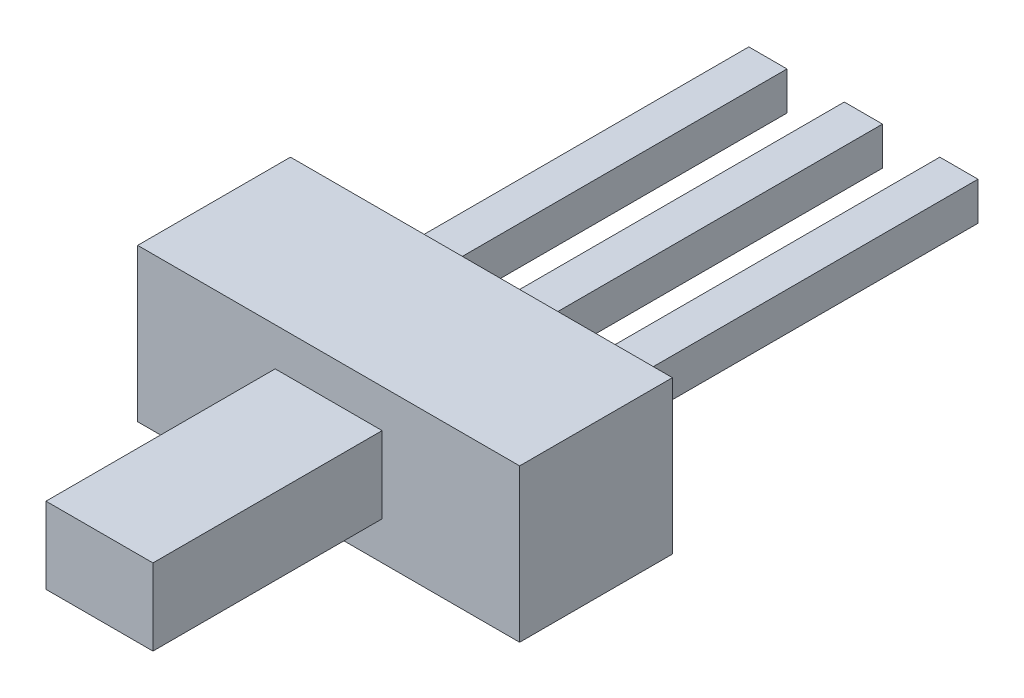
ISO-10303-21;
HEADER;
FILE_DESCRIPTION(('STEP AP214'),'2;1');
FILE_NAME('part.step','',(''),(''),'','','');
FILE_SCHEMA(('AUTOMOTIVE_DESIGN { 1 0 10303 214 1 1 1 1 }'));
ENDSEC;
DATA;
#1=APPLICATION_CONTEXT('core data for automotive mechanical design processes');
#2=APPLICATION_PROTOCOL_DEFINITION('international standard','automotive_design',2000,#1);
#3=PRODUCT_CONTEXT('',#1,'mechanical');
#4=PRODUCT('Part','Part','',(#3));
#5=PRODUCT_RELATED_PRODUCT_CATEGORY('part','',(#4));
#6=PRODUCT_DEFINITION_FORMATION('','',#4);
#7=PRODUCT_DEFINITION_CONTEXT('part definition',#1,'design');
#8=PRODUCT_DEFINITION('design','',#6,#7);
#9=PRODUCT_DEFINITION_SHAPE('','',#8);
#10=(LENGTH_UNIT() NAMED_UNIT(*) SI_UNIT(.MILLI.,.METRE.));
#11=(NAMED_UNIT(*) PLANE_ANGLE_UNIT() SI_UNIT($,.RADIAN.));
#12=(NAMED_UNIT(*) SI_UNIT($,.STERADIAN.) SOLID_ANGLE_UNIT());
#13=UNCERTAINTY_MEASURE_WITH_UNIT(LENGTH_MEASURE(1.E-05),#10,'distance_accuracy_value','');
#14=(GEOMETRIC_REPRESENTATION_CONTEXT(3) GLOBAL_UNCERTAINTY_ASSIGNED_CONTEXT((#13)) GLOBAL_UNIT_ASSIGNED_CONTEXT((#10,
#11,#12)) REPRESENTATION_CONTEXT('',''));
#15=CARTESIAN_POINT('',(0.,0.,0.));
#16=DIRECTION('',(0.,0.,1.));
#17=DIRECTION('',(1.,0.,0.));
#18=AXIS2_PLACEMENT_3D('',#15,#16,#17);
#19=CARTESIAN_POINT('',(0.,0.,0.));
#20=DIRECTION('',(0.,0.,1.));
#21=DIRECTION('',(1.,0.,0.));
#22=AXIS2_PLACEMENT_3D('',#19,#20,#21);
#23=PLANE('',#22);
#24=DIRECTION('',(0.,-1.,0.));
#25=VECTOR('',#24,1.);
#26=CARTESIAN_POINT('',(2.75,-1.25,0.));
#27=LINE('',#26,#25);
#28=CARTESIAN_POINT('',(2.75,-0.750000000000001,0.));
#29=VERTEX_POINT('',#28);
#30=CARTESIAN_POINT('',(2.75,-1.25,0.));
#31=VERTEX_POINT('',#30);
#32=EDGE_CURVE('E229',#29,#31,#27,.T.);
#33=ORIENTED_EDGE('',*,*,#32,.F.);
#34=DIRECTION('',(1.,0.,0.));
#35=VECTOR('',#34,1.);
#36=CARTESIAN_POINT('',(2.25,-0.750000000000001,0.));
#37=LINE('',#36,#35);
#38=CARTESIAN_POINT('',(2.25,-0.750000000000001,0.));
#39=VERTEX_POINT('',#38);
#40=EDGE_CURVE('E234',#39,#29,#37,.T.);
#41=ORIENTED_EDGE('',*,*,#40,.F.);
#42=DIRECTION('',(0.,1.,0.));
#43=VECTOR('',#42,1.);
#44=CARTESIAN_POINT('',(2.25,-1.25,0.));
#45=LINE('',#44,#43);
#46=CARTESIAN_POINT('',(2.25,-1.25,0.));
#47=VERTEX_POINT('',#46);
#48=EDGE_CURVE('E246',#47,#39,#45,.T.);
#49=ORIENTED_EDGE('',*,*,#48,.F.);
#50=DIRECTION('',(-1.,0.,0.));
#51=VECTOR('',#50,1.);
#52=CARTESIAN_POINT('',(2.25,-1.25,0.));
#53=LINE('',#52,#51);
#54=EDGE_CURVE('E243',#31,#47,#53,.T.);
#55=ORIENTED_EDGE('',*,*,#54,.F.);
#56=EDGE_LOOP('',(#33,#41,#49,#55));
#57=FACE_BOUND('',#56,.T.);
#58=DIRECTION('',(0.,-1.,0.));
#59=VECTOR('',#58,1.);
#60=CARTESIAN_POINT('',(0.,0.,0.));
#61=LINE('',#60,#59);
#62=CARTESIAN_POINT('',(0.,0.,0.));
#63=VERTEX_POINT('',#62);
#64=CARTESIAN_POINT('',(0.,-2.,0.));
#65=VERTEX_POINT('',#64);
#66=EDGE_CURVE('E295',#63,#65,#61,.T.);
#67=ORIENTED_EDGE('',*,*,#66,.F.);
#68=DIRECTION('',(-1.,0.,0.));
#69=VECTOR('',#68,1.);
#70=CARTESIAN_POINT('',(0.,0.,0.));
#71=LINE('',#70,#69);
#72=CARTESIAN_POINT('',(5.,0.,0.));
#73=VERTEX_POINT('',#72);
#74=EDGE_CURVE('E300',#73,#63,#71,.T.);
#75=ORIENTED_EDGE('',*,*,#74,.F.);
#76=DIRECTION('',(0.,1.,0.));
#77=VECTOR('',#76,1.);
#78=CARTESIAN_POINT('',(5.,0.,0.));
#79=LINE('',#78,#77);
#80=CARTESIAN_POINT('',(5.,-2.,0.));
#81=VERTEX_POINT('',#80);
#82=EDGE_CURVE('E311',#81,#73,#79,.T.);
#83=ORIENTED_EDGE('',*,*,#82,.F.);
#84=DIRECTION('',(1.,0.,0.));
#85=VECTOR('',#84,1.);
#86=CARTESIAN_POINT('',(0.,-2.,0.));
#87=LINE('',#86,#85);
#88=EDGE_CURVE('E309',#65,#81,#87,.T.);
#89=ORIENTED_EDGE('',*,*,#88,.F.);
#90=EDGE_LOOP('',(#67,#75,#83,#89));
#91=FACE_BOUND('',#90,.T.);
#92=DIRECTION('',(0.,-1.,0.));
#93=VECTOR('',#92,1.);
#94=CARTESIAN_POINT('',(1.5,-1.25,0.));
#95=LINE('',#94,#93);
#96=CARTESIAN_POINT('',(1.5,-0.750000000000001,0.));
#97=VERTEX_POINT('',#96);
#98=CARTESIAN_POINT('',(1.5,-1.25,0.));
#99=VERTEX_POINT('',#98);
#100=EDGE_CURVE('E262',#97,#99,#95,.T.);
#101=ORIENTED_EDGE('',*,*,#100,.F.);
#102=DIRECTION('',(1.,0.,0.));
#103=VECTOR('',#102,1.);
#104=CARTESIAN_POINT('',(1.,-0.750000000000001,0.));
#105=LINE('',#104,#103);
#106=CARTESIAN_POINT('',(1.,-0.750000000000001,0.));
#107=VERTEX_POINT('',#106);
#108=EDGE_CURVE('E267',#107,#97,#105,.T.);
#109=ORIENTED_EDGE('',*,*,#108,.F.);
#110=DIRECTION('',(0.,1.,0.));
#111=VECTOR('',#110,1.);
#112=CARTESIAN_POINT('',(1.,-1.25,0.));
#113=LINE('',#112,#111);
#114=CARTESIAN_POINT('',(1.,-1.25,0.));
#115=VERTEX_POINT('',#114);
#116=EDGE_CURVE('E279',#115,#107,#113,.T.);
#117=ORIENTED_EDGE('',*,*,#116,.F.);
#118=DIRECTION('',(-1.,0.,0.));
#119=VECTOR('',#118,1.);
#120=CARTESIAN_POINT('',(1.,-1.25,0.));
#121=LINE('',#120,#119);
#122=EDGE_CURVE('E276',#99,#115,#121,.T.);
#123=ORIENTED_EDGE('',*,*,#122,.F.);
#124=EDGE_LOOP('',(#101,#109,#117,#123));
#125=FACE_BOUND('',#124,.T.);
#126=DIRECTION('',(0.,-1.,0.));
#127=VECTOR('',#126,1.);
#128=CARTESIAN_POINT('',(4.00000000000001,-1.25,0.));
#129=LINE('',#128,#127);
#130=CARTESIAN_POINT('',(4.00000000000001,-0.750000000000001,0.));
#131=VERTEX_POINT('',#130);
#132=CARTESIAN_POINT('',(4.00000000000001,-1.25,0.));
#133=VERTEX_POINT('',#132);
#134=EDGE_CURVE('E191',#131,#133,#129,.T.);
#135=ORIENTED_EDGE('',*,*,#134,.F.);
#136=DIRECTION('',(1.,0.,0.));
#137=VECTOR('',#136,1.);
#138=CARTESIAN_POINT('',(3.5,-0.750000000000001,0.));
#139=LINE('',#138,#137);
#140=CARTESIAN_POINT('',(3.5,-0.750000000000001,0.));
#141=VERTEX_POINT('',#140);
#142=EDGE_CURVE('E204',#141,#131,#139,.T.);
#143=ORIENTED_EDGE('',*,*,#142,.F.);
#144=DIRECTION('',(0.,1.,0.));
#145=VECTOR('',#144,1.);
#146=CARTESIAN_POINT('',(3.5,-1.25,0.));
#147=LINE('',#146,#145);
#148=CARTESIAN_POINT('',(3.5,-1.25,0.));
#149=VERTEX_POINT('',#148);
#150=EDGE_CURVE('E213',#149,#141,#147,.T.);
#151=ORIENTED_EDGE('',*,*,#150,.F.);
#152=DIRECTION('',(-1.,0.,0.));
#153=VECTOR('',#152,1.);
#154=CARTESIAN_POINT('',(3.5,-1.25,0.));
#155=LINE('',#154,#153);
#156=EDGE_CURVE('E194',#133,#149,#155,.T.);
#157=ORIENTED_EDGE('',*,*,#156,.F.);
#158=EDGE_LOOP('',(#135,#143,#151,#157));
#159=FACE_BOUND('',#158,.T.);
#160=ADVANCED_FACE('F34',(#57,#91,#125,#159),#23,.F.);
#161=CARTESIAN_POINT('',(0.,0.,2.));
#162=DIRECTION('',(1.,0.,0.));
#163=DIRECTION('',(0.,1.,0.));
#164=AXIS2_PLACEMENT_3D('',#161,#162,#163);
#165=PLANE('',#164);
#166=ORIENTED_EDGE('',*,*,#66,.T.);
#167=DIRECTION('',(0.,0.,-1.));
#168=VECTOR('',#167,1.);
#169=CARTESIAN_POINT('',(0.,-2.,2.));
#170=LINE('',#169,#168);
#171=CARTESIAN_POINT('',(0.,-2.,2.));
#172=VERTEX_POINT('',#171);
#173=EDGE_CURVE('E11',#172,#65,#170,.T.);
#174=ORIENTED_EDGE('',*,*,#173,.F.);
#175=DIRECTION('',(0.,-1.,0.));
#176=VECTOR('',#175,1.);
#177=CARTESIAN_POINT('',(0.,0.,2.));
#178=LINE('',#177,#176);
#179=CARTESIAN_POINT('',(0.,0.,2.));
#180=VERTEX_POINT('',#179);
#181=EDGE_CURVE('E296',#180,#172,#178,.T.);
#182=ORIENTED_EDGE('',*,*,#181,.F.);
#183=DIRECTION('',(0.,0.,-1.));
#184=VECTOR('',#183,1.);
#185=CARTESIAN_POINT('',(0.,0.,2.));
#186=LINE('',#185,#184);
#187=EDGE_CURVE('E306',#180,#63,#186,.T.);
#188=ORIENTED_EDGE('',*,*,#187,.T.);
#189=EDGE_LOOP('',(#166,#174,#182,#188));
#190=FACE_BOUND('',#189,.T.);
#191=ADVANCED_FACE('F36',(#190),#165,.F.);
#192=CARTESIAN_POINT('',(0.,-2.,2.));
#193=DIRECTION('',(0.,1.,0.));
#194=DIRECTION('',(0.,0.,1.));
#195=AXIS2_PLACEMENT_3D('',#192,#193,#194);
#196=PLANE('',#195);
#197=ORIENTED_EDGE('',*,*,#88,.T.);
#198=DIRECTION('',(0.,0.,-1.));
#199=VECTOR('',#198,1.);
#200=CARTESIAN_POINT('',(5.,-2.,2.));
#201=LINE('',#200,#199);
#202=CARTESIAN_POINT('',(5.,-2.,2.));
#203=VERTEX_POINT('',#202);
#204=EDGE_CURVE('E42',#203,#81,#201,.T.);
#205=ORIENTED_EDGE('',*,*,#204,.F.);
#206=DIRECTION('',(1.,0.,0.));
#207=VECTOR('',#206,1.);
#208=CARTESIAN_POINT('',(0.,-2.,2.));
#209=LINE('',#208,#207);
#210=EDGE_CURVE('E299',#172,#203,#209,.T.);
#211=ORIENTED_EDGE('',*,*,#210,.F.);
#212=ORIENTED_EDGE('',*,*,#173,.T.);
#213=EDGE_LOOP('',(#197,#205,#211,#212));
#214=FACE_BOUND('',#213,.T.);
#215=ADVANCED_FACE('F339',(#214),#196,.F.);
#216=CARTESIAN_POINT('',(5.,0.,2.));
#217=DIRECTION('',(-1.,0.,0.));
#218=DIRECTION('',(0.,-1.,0.));
#219=AXIS2_PLACEMENT_3D('',#216,#217,#218);
#220=PLANE('',#219);
#221=ORIENTED_EDGE('',*,*,#82,.T.);
#222=DIRECTION('',(0.,0.,-1.));
#223=VECTOR('',#222,1.);
#224=CARTESIAN_POINT('',(5.,0.,2.));
#225=LINE('',#224,#223);
#226=CARTESIAN_POINT('',(5.,0.,2.));
#227=VERTEX_POINT('',#226);
#228=EDGE_CURVE('E316',#227,#73,#225,.T.);
#229=ORIENTED_EDGE('',*,*,#228,.F.);
#230=DIRECTION('',(0.,1.,0.));
#231=VECTOR('',#230,1.);
#232=CARTESIAN_POINT('',(5.,0.,2.));
#233=LINE('',#232,#231);
#234=EDGE_CURVE('E302',#203,#227,#233,.T.);
#235=ORIENTED_EDGE('',*,*,#234,.F.);
#236=ORIENTED_EDGE('',*,*,#204,.T.);
#237=EDGE_LOOP('',(#221,#229,#235,#236));
#238=FACE_BOUND('',#237,.T.);
#239=ADVANCED_FACE('F323',(#238),#220,.F.);
#240=CARTESIAN_POINT('',(0.,0.,2.));
#241=DIRECTION('',(0.,-1.,0.));
#242=DIRECTION('',(0.,0.,-1.));
#243=AXIS2_PLACEMENT_3D('',#240,#241,#242);
#244=PLANE('',#243);
#245=ORIENTED_EDGE('',*,*,#74,.T.);
#246=ORIENTED_EDGE('',*,*,#187,.F.);
#247=DIRECTION('',(-1.,0.,0.));
#248=VECTOR('',#247,1.);
#249=CARTESIAN_POINT('',(0.,0.,2.));
#250=LINE('',#249,#248);
#251=EDGE_CURVE('E304',#227,#180,#250,.T.);
#252=ORIENTED_EDGE('',*,*,#251,.F.);
#253=ORIENTED_EDGE('',*,*,#228,.T.);
#254=EDGE_LOOP('',(#245,#246,#252,#253));
#255=FACE_BOUND('',#254,.T.);
#256=ADVANCED_FACE('F332',(#255),#244,.F.);
#257=CARTESIAN_POINT('',(0.,0.,2.));
#258=DIRECTION('',(0.,0.,1.));
#259=DIRECTION('',(1.,0.,0.));
#260=AXIS2_PLACEMENT_3D('',#257,#258,#259);
#261=PLANE('',#260);
#262=DIRECTION('',(0.,1.,0.));
#263=VECTOR('',#262,1.);
#264=CARTESIAN_POINT('',(3.2,-0.500000000000001,2.));
#265=LINE('',#264,#263);
#266=CARTESIAN_POINT('',(3.2,-1.5,2.));
#267=VERTEX_POINT('',#266);
#268=CARTESIAN_POINT('',(3.2,-0.500000000000001,2.));
#269=VERTEX_POINT('',#268);
#270=EDGE_CURVE('E49',#267,#269,#265,.T.);
#271=ORIENTED_EDGE('',*,*,#270,.F.);
#272=DIRECTION('',(1.,0.,0.));
#273=VECTOR('',#272,1.);
#274=CARTESIAN_POINT('',(1.8,-1.5,2.));
#275=LINE('',#274,#273);
#276=CARTESIAN_POINT('',(1.8,-1.5,2.));
#277=VERTEX_POINT('',#276);
#278=EDGE_CURVE('E53',#277,#267,#275,.T.);
#279=ORIENTED_EDGE('',*,*,#278,.F.);
#280=DIRECTION('',(0.,-1.,0.));
#281=VECTOR('',#280,1.);
#282=CARTESIAN_POINT('',(1.8,-0.500000000000001,2.));
#283=LINE('',#282,#281);
#284=CARTESIAN_POINT('',(1.8,-0.500000000000001,2.));
#285=VERTEX_POINT('',#284);
#286=EDGE_CURVE('E584',#285,#277,#283,.T.);
#287=ORIENTED_EDGE('',*,*,#286,.F.);
#288=DIRECTION('',(-1.,0.,0.));
#289=VECTOR('',#288,1.);
#290=CARTESIAN_POINT('',(1.8,-0.500000000000001,2.));
#291=LINE('',#290,#289);
#292=EDGE_CURVE('E590',#269,#285,#291,.T.);
#293=ORIENTED_EDGE('',*,*,#292,.F.);
#294=EDGE_LOOP('',(#271,#279,#287,#293));
#295=FACE_BOUND('',#294,.T.);
#296=ORIENTED_EDGE('',*,*,#181,.T.);
#297=ORIENTED_EDGE('',*,*,#210,.T.);
#298=ORIENTED_EDGE('',*,*,#234,.T.);
#299=ORIENTED_EDGE('',*,*,#251,.T.);
#300=EDGE_LOOP('',(#296,#297,#298,#299));
#301=FACE_BOUND('',#300,.T.);
#302=ADVANCED_FACE('F338',(#295,#301),#261,.T.);
#303=CARTESIAN_POINT('',(1.5,-1.25,-5.));
#304=DIRECTION('',(-1.,0.,0.));
#305=DIRECTION('',(0.,-1.,0.));
#306=AXIS2_PLACEMENT_3D('',#303,#304,#305);
#307=PLANE('',#306);
#308=ORIENTED_EDGE('',*,*,#100,.T.);
#309=DIRECTION('',(0.,0.,1.));
#310=VECTOR('',#309,1.);
#311=CARTESIAN_POINT('',(1.5,-1.25,-5.));
#312=LINE('',#311,#310);
#313=CARTESIAN_POINT('',(1.5,-1.25,-5.));
#314=VERTEX_POINT('',#313);
#315=EDGE_CURVE('E292',#314,#99,#312,.T.);
#316=ORIENTED_EDGE('',*,*,#315,.F.);
#317=DIRECTION('',(0.,-1.,0.));
#318=VECTOR('',#317,1.);
#319=CARTESIAN_POINT('',(1.5,-1.25,-5.));
#320=LINE('',#319,#318);
#321=CARTESIAN_POINT('',(1.5,-0.750000000000001,-5.));
#322=VERTEX_POINT('',#321);
#323=EDGE_CURVE('E263',#322,#314,#320,.T.);
#324=ORIENTED_EDGE('',*,*,#323,.F.);
#325=DIRECTION('',(0.,0.,1.));
#326=VECTOR('',#325,1.);
#327=CARTESIAN_POINT('',(1.5,-0.750000000000001,-5.));
#328=LINE('',#327,#326);
#329=EDGE_CURVE('E273',#322,#97,#328,.T.);
#330=ORIENTED_EDGE('',*,*,#329,.T.);
#331=EDGE_LOOP('',(#308,#316,#324,#330));
#332=FACE_BOUND('',#331,.T.);
#333=ADVANCED_FACE('F358',(#332),#307,.F.);
#334=CARTESIAN_POINT('',(1.,-1.25,-5.));
#335=DIRECTION('',(0.,1.,0.));
#336=DIRECTION('',(0.,0.,1.));
#337=AXIS2_PLACEMENT_3D('',#334,#335,#336);
#338=PLANE('',#337);
#339=ORIENTED_EDGE('',*,*,#122,.T.);
#340=DIRECTION('',(0.,0.,1.));
#341=VECTOR('',#340,1.);
#342=CARTESIAN_POINT('',(1.,-1.25,-5.));
#343=LINE('',#342,#341);
#344=CARTESIAN_POINT('',(1.,-1.25,-5.));
#345=VERTEX_POINT('',#344);
#346=EDGE_CURVE('E289',#345,#115,#343,.T.);
#347=ORIENTED_EDGE('',*,*,#346,.F.);
#348=DIRECTION('',(-1.,0.,0.));
#349=VECTOR('',#348,1.);
#350=CARTESIAN_POINT('',(1.,-1.25,-5.));
#351=LINE('',#350,#349);
#352=EDGE_CURVE('E266',#314,#345,#351,.T.);
#353=ORIENTED_EDGE('',*,*,#352,.F.);
#354=ORIENTED_EDGE('',*,*,#315,.T.);
#355=EDGE_LOOP('',(#339,#347,#353,#354));
#356=FACE_BOUND('',#355,.T.);
#357=ADVANCED_FACE('F362',(#356),#338,.F.);
#358=CARTESIAN_POINT('',(1.,-1.25,-5.));
#359=DIRECTION('',(1.,0.,0.));
#360=DIRECTION('',(0.,0.,-1.));
#361=AXIS2_PLACEMENT_3D('',#358,#359,#360);
#362=PLANE('',#361);
#363=ORIENTED_EDGE('',*,*,#116,.T.);
#364=DIRECTION('',(0.,0.,1.));
#365=VECTOR('',#364,1.);
#366=CARTESIAN_POINT('',(1.,-0.750000000000001,-5.));
#367=LINE('',#366,#365);
#368=CARTESIAN_POINT('',(1.,-0.750000000000001,-5.));
#369=VERTEX_POINT('',#368);
#370=EDGE_CURVE('E286',#369,#107,#367,.T.);
#371=ORIENTED_EDGE('',*,*,#370,.F.);
#372=DIRECTION('',(0.,1.,0.));
#373=VECTOR('',#372,1.);
#374=CARTESIAN_POINT('',(1.,-1.25,-5.));
#375=LINE('',#374,#373);
#376=EDGE_CURVE('E269',#345,#369,#375,.T.);
#377=ORIENTED_EDGE('',*,*,#376,.F.);
#378=ORIENTED_EDGE('',*,*,#346,.T.);
#379=EDGE_LOOP('',(#363,#371,#377,#378));
#380=FACE_BOUND('',#379,.T.);
#381=ADVANCED_FACE('F367',(#380),#362,.F.);
#382=CARTESIAN_POINT('',(1.,-0.750000000000001,-5.));
#383=DIRECTION('',(0.,-1.,0.));
#384=DIRECTION('',(1.,0.,0.));
#385=AXIS2_PLACEMENT_3D('',#382,#383,#384);
#386=PLANE('',#385);
#387=ORIENTED_EDGE('',*,*,#108,.T.);
#388=ORIENTED_EDGE('',*,*,#329,.F.);
#389=DIRECTION('',(1.,0.,0.));
#390=VECTOR('',#389,1.);
#391=CARTESIAN_POINT('',(1.,-0.750000000000001,-5.));
#392=LINE('',#391,#390);
#393=EDGE_CURVE('E271',#369,#322,#392,.T.);
#394=ORIENTED_EDGE('',*,*,#393,.F.);
#395=ORIENTED_EDGE('',*,*,#370,.T.);
#396=EDGE_LOOP('',(#387,#388,#394,#395));
#397=FACE_BOUND('',#396,.T.);
#398=ADVANCED_FACE('F373',(#397),#386,.F.);
#399=CARTESIAN_POINT('',(0.,0.,-5.));
#400=DIRECTION('',(0.,0.,-1.));
#401=DIRECTION('',(-1.,0.,0.));
#402=AXIS2_PLACEMENT_3D('',#399,#400,#401);
#403=PLANE('',#402);
#404=ORIENTED_EDGE('',*,*,#323,.T.);
#405=ORIENTED_EDGE('',*,*,#352,.T.);
#406=ORIENTED_EDGE('',*,*,#376,.T.);
#407=ORIENTED_EDGE('',*,*,#393,.T.);
#408=EDGE_LOOP('',(#404,#405,#406,#407));
#409=FACE_BOUND('',#408,.T.);
#410=ADVANCED_FACE('F377',(#409),#403,.T.);
#411=CARTESIAN_POINT('',(2.75,-1.25,-5.));
#412=DIRECTION('',(-1.,0.,0.));
#413=DIRECTION('',(0.,0.,1.));
#414=AXIS2_PLACEMENT_3D('',#411,#412,#413);
#415=PLANE('',#414);
#416=ORIENTED_EDGE('',*,*,#32,.T.);
#417=DIRECTION('',(0.,0.,1.));
#418=VECTOR('',#417,1.);
#419=CARTESIAN_POINT('',(2.75,-1.25,-5.));
#420=LINE('',#419,#418);
#421=CARTESIAN_POINT('',(2.75,-1.25,-5.));
#422=VERTEX_POINT('',#421);
#423=EDGE_CURVE('E259',#422,#31,#420,.T.);
#424=ORIENTED_EDGE('',*,*,#423,.F.);
#425=DIRECTION('',(0.,-1.,0.));
#426=VECTOR('',#425,1.);
#427=CARTESIAN_POINT('',(2.75,-1.25,-5.));
#428=LINE('',#427,#426);
#429=CARTESIAN_POINT('',(2.75,-0.750000000000001,-5.));
#430=VERTEX_POINT('',#429);
#431=EDGE_CURVE('E230',#430,#422,#428,.T.);
#432=ORIENTED_EDGE('',*,*,#431,.F.);
#433=DIRECTION('',(0.,0.,1.));
#434=VECTOR('',#433,1.);
#435=CARTESIAN_POINT('',(2.75,-0.750000000000001,-5.));
#436=LINE('',#435,#434);
#437=EDGE_CURVE('E240',#430,#29,#436,.T.);
#438=ORIENTED_EDGE('',*,*,#437,.T.);
#439=EDGE_LOOP('',(#416,#424,#432,#438));
#440=FACE_BOUND('',#439,.T.);
#441=ADVANCED_FACE('F381',(#440),#415,.F.);
#442=CARTESIAN_POINT('',(2.25,-1.25,-5.));
#443=DIRECTION('',(0.,1.,0.));
#444=DIRECTION('',(-1.,0.,0.));
#445=AXIS2_PLACEMENT_3D('',#442,#443,#444);
#446=PLANE('',#445);
#447=ORIENTED_EDGE('',*,*,#54,.T.);
#448=DIRECTION('',(0.,0.,1.));
#449=VECTOR('',#448,1.);
#450=CARTESIAN_POINT('',(2.25,-1.25,-5.));
#451=LINE('',#450,#449);
#452=CARTESIAN_POINT('',(2.25,-1.25,-5.));
#453=VERTEX_POINT('',#452);
#454=EDGE_CURVE('E256',#453,#47,#451,.T.);
#455=ORIENTED_EDGE('',*,*,#454,.F.);
#456=DIRECTION('',(-1.,0.,0.));
#457=VECTOR('',#456,1.);
#458=CARTESIAN_POINT('',(2.25,-1.25,-5.));
#459=LINE('',#458,#457);
#460=EDGE_CURVE('E233',#422,#453,#459,.T.);
#461=ORIENTED_EDGE('',*,*,#460,.F.);
#462=ORIENTED_EDGE('',*,*,#423,.T.);
#463=EDGE_LOOP('',(#447,#455,#461,#462));
#464=FACE_BOUND('',#463,.T.);
#465=ADVANCED_FACE('F385',(#464),#446,.F.);
#466=CARTESIAN_POINT('',(2.25,-1.25,-5.));
#467=DIRECTION('',(1.,0.,0.));
#468=DIRECTION('',(0.,0.,-1.));
#469=AXIS2_PLACEMENT_3D('',#466,#467,#468);
#470=PLANE('',#469);
#471=ORIENTED_EDGE('',*,*,#48,.T.);
#472=DIRECTION('',(0.,0.,1.));
#473=VECTOR('',#472,1.);
#474=CARTESIAN_POINT('',(2.25,-0.750000000000001,-5.));
#475=LINE('',#474,#473);
#476=CARTESIAN_POINT('',(2.25,-0.750000000000001,-5.));
#477=VERTEX_POINT('',#476);
#478=EDGE_CURVE('E253',#477,#39,#475,.T.);
#479=ORIENTED_EDGE('',*,*,#478,.F.);
#480=DIRECTION('',(0.,1.,0.));
#481=VECTOR('',#480,1.);
#482=CARTESIAN_POINT('',(2.25,-1.25,-5.));
#483=LINE('',#482,#481);
#484=EDGE_CURVE('E236',#453,#477,#483,.T.);
#485=ORIENTED_EDGE('',*,*,#484,.F.);
#486=ORIENTED_EDGE('',*,*,#454,.T.);
#487=EDGE_LOOP('',(#471,#479,#485,#486));
#488=FACE_BOUND('',#487,.T.);
#489=ADVANCED_FACE('F389',(#488),#470,.F.);
#490=CARTESIAN_POINT('',(2.25,-0.750000000000001,-5.));
#491=DIRECTION('',(0.,-1.,0.));
#492=DIRECTION('',(0.,0.,-1.));
#493=AXIS2_PLACEMENT_3D('',#490,#491,#492);
#494=PLANE('',#493);
#495=ORIENTED_EDGE('',*,*,#40,.T.);
#496=ORIENTED_EDGE('',*,*,#437,.F.);
#497=DIRECTION('',(1.,0.,0.));
#498=VECTOR('',#497,1.);
#499=CARTESIAN_POINT('',(2.25,-0.750000000000001,-5.));
#500=LINE('',#499,#498);
#501=EDGE_CURVE('E238',#477,#430,#500,.T.);
#502=ORIENTED_EDGE('',*,*,#501,.F.);
#503=ORIENTED_EDGE('',*,*,#478,.T.);
#504=EDGE_LOOP('',(#495,#496,#502,#503));
#505=FACE_BOUND('',#504,.T.);
#506=ADVANCED_FACE('F393',(#505),#494,.F.);
#507=CARTESIAN_POINT('',(0.,0.,-5.));
#508=DIRECTION('',(0.,0.,-1.));
#509=DIRECTION('',(-1.,0.,0.));
#510=AXIS2_PLACEMENT_3D('',#507,#508,#509);
#511=PLANE('',#510);
#512=ORIENTED_EDGE('',*,*,#431,.T.);
#513=ORIENTED_EDGE('',*,*,#460,.T.);
#514=ORIENTED_EDGE('',*,*,#484,.T.);
#515=ORIENTED_EDGE('',*,*,#501,.T.);
#516=EDGE_LOOP('',(#512,#513,#514,#515));
#517=FACE_BOUND('',#516,.T.);
#518=ADVANCED_FACE('F397',(#517),#511,.T.);
#519=CARTESIAN_POINT('',(4.00000000000001,-1.25,-5.));
#520=DIRECTION('',(-1.,0.,0.));
#521=DIRECTION('',(0.,0.,1.));
#522=AXIS2_PLACEMENT_3D('',#519,#520,#521);
#523=PLANE('',#522);
#524=ORIENTED_EDGE('',*,*,#134,.T.);
#525=DIRECTION('',(0.,0.,1.));
#526=VECTOR('',#525,1.);
#527=CARTESIAN_POINT('',(4.00000000000001,-1.25,-5.));
#528=LINE('',#527,#526);
#529=CARTESIAN_POINT('',(4.00000000000001,-1.25,-5.));
#530=VERTEX_POINT('',#529);
#531=EDGE_CURVE('E226',#530,#133,#528,.T.);
#532=ORIENTED_EDGE('',*,*,#531,.F.);
#533=DIRECTION('',(0.,-1.,0.));
#534=VECTOR('',#533,1.);
#535=CARTESIAN_POINT('',(4.00000000000001,-1.25,-5.));
#536=LINE('',#535,#534);
#537=CARTESIAN_POINT('',(4.00000000000001,-0.750000000000001,-5.));
#538=VERTEX_POINT('',#537);
#539=EDGE_CURVE('E200',#538,#530,#536,.T.);
#540=ORIENTED_EDGE('',*,*,#539,.F.);
#541=DIRECTION('',(0.,0.,1.));
#542=VECTOR('',#541,1.);
#543=CARTESIAN_POINT('',(4.00000000000001,-0.750000000000001,-5.));
#544=LINE('',#543,#542);
#545=EDGE_CURVE('E209',#538,#131,#544,.T.);
#546=ORIENTED_EDGE('',*,*,#545,.T.);
#547=EDGE_LOOP('',(#524,#532,#540,#546));
#548=FACE_BOUND('',#547,.T.);
#549=ADVANCED_FACE('F401',(#548),#523,.F.);
#550=CARTESIAN_POINT('',(3.5,-1.25,-5.));
#551=DIRECTION('',(0.,1.,0.));
#552=DIRECTION('',(0.,0.,1.));
#553=AXIS2_PLACEMENT_3D('',#550,#551,#552);
#554=PLANE('',#553);
#555=ORIENTED_EDGE('',*,*,#156,.T.);
#556=DIRECTION('',(0.,0.,1.));
#557=VECTOR('',#556,1.);
#558=CARTESIAN_POINT('',(3.5,-1.25,-5.));
#559=LINE('',#558,#557);
#560=CARTESIAN_POINT('',(3.5,-1.25,-5.));
#561=VERTEX_POINT('',#560);
#562=EDGE_CURVE('E223',#561,#149,#559,.T.);
#563=ORIENTED_EDGE('',*,*,#562,.F.);
#564=DIRECTION('',(-1.,0.,0.));
#565=VECTOR('',#564,1.);
#566=CARTESIAN_POINT('',(3.5,-1.25,-5.));
#567=LINE('',#566,#565);
#568=EDGE_CURVE('E203',#530,#561,#567,.T.);
#569=ORIENTED_EDGE('',*,*,#568,.F.);
#570=ORIENTED_EDGE('',*,*,#531,.T.);
#571=EDGE_LOOP('',(#555,#563,#569,#570));
#572=FACE_BOUND('',#571,.T.);
#573=ADVANCED_FACE('F405',(#572),#554,.F.);
#574=CARTESIAN_POINT('',(3.5,-1.25,-5.));
#575=DIRECTION('',(1.,0.,0.));
#576=DIRECTION('',(0.,0.,-1.));
#577=AXIS2_PLACEMENT_3D('',#574,#575,#576);
#578=PLANE('',#577);
#579=ORIENTED_EDGE('',*,*,#150,.T.);
#580=DIRECTION('',(0.,0.,1.));
#581=VECTOR('',#580,1.);
#582=CARTESIAN_POINT('',(3.5,-0.750000000000001,-5.));
#583=LINE('',#582,#581);
#584=CARTESIAN_POINT('',(3.5,-0.750000000000001,-5.));
#585=VERTEX_POINT('',#584);
#586=EDGE_CURVE('E220',#585,#141,#583,.T.);
#587=ORIENTED_EDGE('',*,*,#586,.F.);
#588=DIRECTION('',(0.,1.,0.));
#589=VECTOR('',#588,1.);
#590=CARTESIAN_POINT('',(3.5,-1.25,-5.));
#591=LINE('',#590,#589);
#592=EDGE_CURVE('E206',#561,#585,#591,.T.);
#593=ORIENTED_EDGE('',*,*,#592,.F.);
#594=ORIENTED_EDGE('',*,*,#562,.T.);
#595=EDGE_LOOP('',(#579,#587,#593,#594));
#596=FACE_BOUND('',#595,.T.);
#597=ADVANCED_FACE('F409',(#596),#578,.F.);
#598=CARTESIAN_POINT('',(3.5,-0.750000000000001,-5.));
#599=DIRECTION('',(0.,-1.,0.));
#600=DIRECTION('',(1.,0.,0.));
#601=AXIS2_PLACEMENT_3D('',#598,#599,#600);
#602=PLANE('',#601);
#603=ORIENTED_EDGE('',*,*,#142,.T.);
#604=ORIENTED_EDGE('',*,*,#545,.F.);
#605=DIRECTION('',(1.,0.,0.));
#606=VECTOR('',#605,1.);
#607=CARTESIAN_POINT('',(3.5,-0.750000000000001,-5.));
#608=LINE('',#607,#606);
#609=EDGE_CURVE('E208',#585,#538,#608,.T.);
#610=ORIENTED_EDGE('',*,*,#609,.F.);
#611=ORIENTED_EDGE('',*,*,#586,.T.);
#612=EDGE_LOOP('',(#603,#604,#610,#611));
#613=FACE_BOUND('',#612,.T.);
#614=ADVANCED_FACE('F413',(#613),#602,.F.);
#615=CARTESIAN_POINT('',(0.,0.,-5.));
#616=DIRECTION('',(0.,0.,-1.));
#617=DIRECTION('',(-1.,0.,0.));
#618=AXIS2_PLACEMENT_3D('',#615,#616,#617);
#619=PLANE('',#618);
#620=ORIENTED_EDGE('',*,*,#539,.T.);
#621=ORIENTED_EDGE('',*,*,#568,.T.);
#622=ORIENTED_EDGE('',*,*,#592,.T.);
#623=ORIENTED_EDGE('',*,*,#609,.T.);
#624=EDGE_LOOP('',(#620,#621,#622,#623));
#625=FACE_BOUND('',#624,.T.);
#626=ADVANCED_FACE('F417',(#625),#619,.T.);
#627=CARTESIAN_POINT('',(3.2,-0.500000000000001,5.));
#628=DIRECTION('',(-1.,0.,0.));
#629=DIRECTION('',(0.,0.,1.));
#630=AXIS2_PLACEMENT_3D('',#627,#628,#629);
#631=PLANE('',#630);
#632=ORIENTED_EDGE('',*,*,#270,.T.);
#633=DIRECTION('',(0.,0.,-1.));
#634=VECTOR('',#633,1.);
#635=CARTESIAN_POINT('',(3.2,-0.500000000000001,5.));
#636=LINE('',#635,#634);
#637=CARTESIAN_POINT('',(3.2,-0.500000000000001,5.));
#638=VERTEX_POINT('',#637);
#639=EDGE_CURVE('E174',#638,#269,#636,.T.);
#640=ORIENTED_EDGE('',*,*,#639,.F.);
#641=DIRECTION('',(0.,1.,0.));
#642=VECTOR('',#641,1.);
#643=CARTESIAN_POINT('',(3.2,-0.500000000000001,5.));
#644=LINE('',#643,#642);
#645=CARTESIAN_POINT('',(3.2,-1.5,5.));
#646=VERTEX_POINT('',#645);
#647=EDGE_CURVE('E180',#646,#638,#644,.T.);
#648=ORIENTED_EDGE('',*,*,#647,.F.);
#649=DIRECTION('',(0.,0.,-1.));
#650=VECTOR('',#649,1.);
#651=CARTESIAN_POINT('',(3.2,-1.5,5.));
#652=LINE('',#651,#650);
#653=EDGE_CURVE('E582',#646,#267,#652,.T.);
#654=ORIENTED_EDGE('',*,*,#653,.T.);
#655=EDGE_LOOP('',(#632,#640,#648,#654));
#656=FACE_BOUND('',#655,.T.);
#657=ADVANCED_FACE('F190',(#656),#631,.F.);
#658=CARTESIAN_POINT('',(1.8,-0.500000000000001,5.));
#659=DIRECTION('',(0.,-1.,0.));
#660=DIRECTION('',(0.,0.,-1.));
#661=AXIS2_PLACEMENT_3D('',#658,#659,#660);
#662=PLANE('',#661);
#663=ORIENTED_EDGE('',*,*,#292,.T.);
#664=DIRECTION('',(0.,0.,-1.));
#665=VECTOR('',#664,1.);
#666=CARTESIAN_POINT('',(1.8,-0.500000000000001,5.));
#667=LINE('',#666,#665);
#668=CARTESIAN_POINT('',(1.8,-0.500000000000001,5.));
#669=VERTEX_POINT('',#668);
#670=EDGE_CURVE('E176',#669,#285,#667,.T.);
#671=ORIENTED_EDGE('',*,*,#670,.F.);
#672=DIRECTION('',(-1.,0.,0.));
#673=VECTOR('',#672,1.);
#674=CARTESIAN_POINT('',(1.8,-0.500000000000001,5.));
#675=LINE('',#674,#673);
#676=EDGE_CURVE('E169',#638,#669,#675,.T.);
#677=ORIENTED_EDGE('',*,*,#676,.F.);
#678=ORIENTED_EDGE('',*,*,#639,.T.);
#679=EDGE_LOOP('',(#663,#671,#677,#678));
#680=FACE_BOUND('',#679,.T.);
#681=ADVANCED_FACE('F172',(#680),#662,.F.);
#682=CARTESIAN_POINT('',(1.8,-0.500000000000001,5.));
#683=DIRECTION('',(1.,0.,0.));
#684=DIRECTION('',(0.,1.,0.));
#685=AXIS2_PLACEMENT_3D('',#682,#683,#684);
#686=PLANE('',#685);
#687=ORIENTED_EDGE('',*,*,#286,.T.);
#688=DIRECTION('',(0.,0.,-1.));
#689=VECTOR('',#688,1.);
#690=CARTESIAN_POINT('',(1.8,-1.5,5.));
#691=LINE('',#690,#689);
#692=CARTESIAN_POINT('',(1.8,-1.5,5.));
#693=VERTEX_POINT('',#692);
#694=EDGE_CURVE('E196',#693,#277,#691,.T.);
#695=ORIENTED_EDGE('',*,*,#694,.F.);
#696=DIRECTION('',(0.,-1.,0.));
#697=VECTOR('',#696,1.);
#698=CARTESIAN_POINT('',(1.8,-0.500000000000001,5.));
#699=LINE('',#698,#697);
#700=EDGE_CURVE('E179',#669,#693,#699,.T.);
#701=ORIENTED_EDGE('',*,*,#700,.F.);
#702=ORIENTED_EDGE('',*,*,#670,.T.);
#703=EDGE_LOOP('',(#687,#695,#701,#702));
#704=FACE_BOUND('',#703,.T.);
#705=ADVANCED_FACE('F426',(#704),#686,.F.);
#706=CARTESIAN_POINT('',(1.8,-1.5,5.));
#707=DIRECTION('',(0.,1.,0.));
#708=DIRECTION('',(0.,0.,1.));
#709=AXIS2_PLACEMENT_3D('',#706,#707,#708);
#710=PLANE('',#709);
#711=ORIENTED_EDGE('',*,*,#278,.T.);
#712=ORIENTED_EDGE('',*,*,#653,.F.);
#713=DIRECTION('',(1.,0.,0.));
#714=VECTOR('',#713,1.);
#715=CARTESIAN_POINT('',(1.8,-1.5,5.));
#716=LINE('',#715,#714);
#717=EDGE_CURVE('E185',#693,#646,#716,.T.);
#718=ORIENTED_EDGE('',*,*,#717,.F.);
#719=ORIENTED_EDGE('',*,*,#694,.T.);
#720=EDGE_LOOP('',(#711,#712,#718,#719));
#721=FACE_BOUND('',#720,.T.);
#722=ADVANCED_FACE('F429',(#721),#710,.F.);
#723=CARTESIAN_POINT('',(0.,0.,5.));
#724=DIRECTION('',(0.,0.,1.));
#725=DIRECTION('',(1.,0.,0.));
#726=AXIS2_PLACEMENT_3D('',#723,#724,#725);
#727=PLANE('',#726);
#728=ORIENTED_EDGE('',*,*,#647,.T.);
#729=ORIENTED_EDGE('',*,*,#676,.T.);
#730=ORIENTED_EDGE('',*,*,#700,.T.);
#731=ORIENTED_EDGE('',*,*,#717,.T.);
#732=EDGE_LOOP('',(#728,#729,#730,#731));
#733=FACE_BOUND('',#732,.T.);
#734=ADVANCED_FACE('F183',(#733),#727,.T.);
#735=CLOSED_SHELL('',(#160,#191,#215,#239,#256,#302,#333,#357,#381,#398,#410,#441,#465,#489,
#506,#518,#549,#573,#597,#614,#626,#657,#681,#705,#722,#734));
#736=MANIFOLD_SOLID_BREP('B2',#735);
#737=ADVANCED_BREP_SHAPE_REPRESENTATION('',(#18,#736),#14);
#738=SHAPE_DEFINITION_REPRESENTATION(#9,#737);
ENDSEC;
END-ISO-10303-21;
